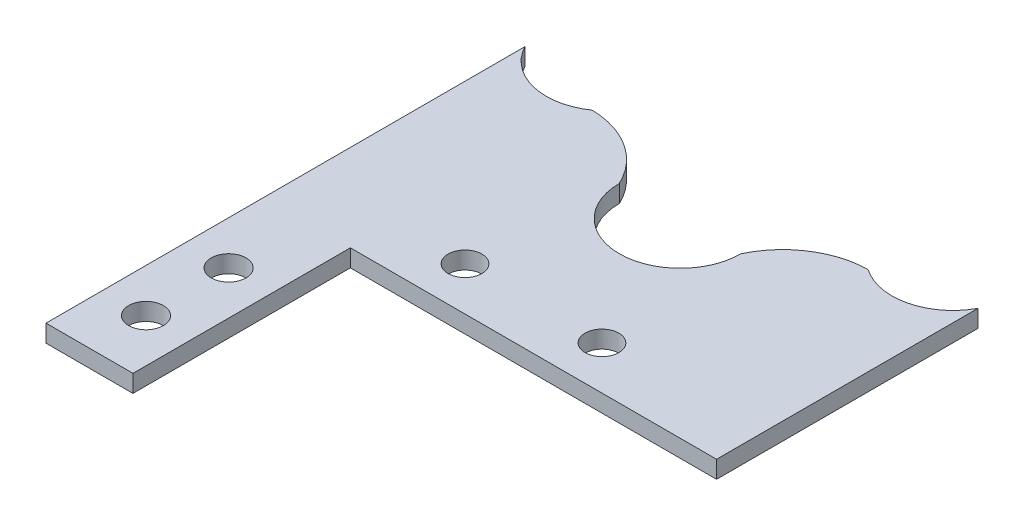
ISO-10303-21;
HEADER;
FILE_DESCRIPTION(('STEP AP214'),'2;1');
FILE_NAME('part.step','',(''),(''),'','','');
FILE_SCHEMA(('AUTOMOTIVE_DESIGN { 1 0 10303 214 1 1 1 1 }'));
ENDSEC;
DATA;
#1=APPLICATION_CONTEXT('core data for automotive mechanical design processes');
#2=APPLICATION_PROTOCOL_DEFINITION('international standard','automotive_design',2000,#1);
#3=PRODUCT_CONTEXT('',#1,'mechanical');
#4=PRODUCT('Part','Part','',(#3));
#5=PRODUCT_RELATED_PRODUCT_CATEGORY('part','',(#4));
#6=PRODUCT_DEFINITION_FORMATION('','',#4);
#7=PRODUCT_DEFINITION_CONTEXT('part definition',#1,'design');
#8=PRODUCT_DEFINITION('design','',#6,#7);
#9=PRODUCT_DEFINITION_SHAPE('','',#8);
#10=(LENGTH_UNIT() NAMED_UNIT(*) SI_UNIT(.MILLI.,.METRE.));
#11=(NAMED_UNIT(*) PLANE_ANGLE_UNIT() SI_UNIT($,.RADIAN.));
#12=(NAMED_UNIT(*) SI_UNIT($,.STERADIAN.) SOLID_ANGLE_UNIT());
#13=UNCERTAINTY_MEASURE_WITH_UNIT(LENGTH_MEASURE(1.E-05),#10,'distance_accuracy_value','');
#14=(GEOMETRIC_REPRESENTATION_CONTEXT(3) GLOBAL_UNCERTAINTY_ASSIGNED_CONTEXT((#13)) GLOBAL_UNIT_ASSIGNED_CONTEXT((#10,
#11,#12)) REPRESENTATION_CONTEXT('',''));
#15=CARTESIAN_POINT('',(0.,0.,0.));
#16=DIRECTION('',(0.,0.,1.));
#17=DIRECTION('',(1.,0.,0.));
#18=AXIS2_PLACEMENT_3D('',#15,#16,#17);
#19=CARTESIAN_POINT('',(16.0451571243017,-2.,4.26440295899608));
#20=DIRECTION('',(0.,1.,0.));
#21=DIRECTION('',(0.,0.,1.));
#22=AXIS2_PLACEMENT_3D('',#19,#20,#21);
#23=CYLINDRICAL_SURFACE('',#22,10.);
#24=CARTESIAN_POINT('',(16.0451571243017,0.,4.26440295899608));
#25=DIRECTION('',(0.,1.,0.));
#26=DIRECTION('',(0.,0.,1.));
#27=AXIS2_PLACEMENT_3D('',#24,#25,#26);
#28=CIRCLE('',#27,10.);
#29=CARTESIAN_POINT('',(15.8700792263388,0.,-5.73406431002295));
#30=VERTEX_POINT('',#29);
#31=CARTESIAN_POINT('',(7.,0.,0.));
#32=VERTEX_POINT('',#31);
#33=EDGE_CURVE('E152',#30,#32,#28,.T.);
#34=ORIENTED_EDGE('',*,*,#33,.F.);
#35=DIRECTION('',(0.,1.,0.));
#36=VECTOR('',#35,1.);
#37=CARTESIAN_POINT('',(15.8700792263388,-2.,-5.73406431002295));
#38=LINE('',#37,#36);
#39=CARTESIAN_POINT('',(15.8700792263388,-2.,-5.73406431002295));
#40=VERTEX_POINT('',#39);
#41=EDGE_CURVE('E11',#40,#30,#38,.T.);
#42=ORIENTED_EDGE('',*,*,#41,.F.);
#43=CARTESIAN_POINT('',(16.0451571243017,-2.,4.26440295899608));
#44=DIRECTION('',(0.,1.,0.));
#45=DIRECTION('',(0.,0.,1.));
#46=AXIS2_PLACEMENT_3D('',#43,#44,#45);
#47=CIRCLE('',#46,10.);
#48=CARTESIAN_POINT('',(7.,-2.,0.));
#49=VERTEX_POINT('',#48);
#50=EDGE_CURVE('E179',#40,#49,#47,.T.);
#51=ORIENTED_EDGE('',*,*,#50,.T.);
#52=DIRECTION('',(0.,1.,0.));
#53=VECTOR('',#52,1.);
#54=CARTESIAN_POINT('',(7.,-2.,0.));
#55=LINE('',#54,#53);
#56=EDGE_CURVE('E46',#49,#32,#55,.T.);
#57=ORIENTED_EDGE('',*,*,#56,.T.);
#58=EDGE_LOOP('',(#34,#42,#51,#57));
#59=FACE_BOUND('',#58,.T.);
#60=ADVANCED_FACE('F43',(#59),#23,.T.);
#61=CARTESIAN_POINT('',(19.8752830168529,-2.,-11.4749999999999));
#62=DIRECTION('',(0.,1.,0.));
#63=DIRECTION('',(0.,0.,1.));
#64=AXIS2_PLACEMENT_3D('',#61,#62,#63);
#65=CYLINDRICAL_SURFACE('',#64,7.);
#66=CARTESIAN_POINT('',(19.8752830168529,0.,-11.4749999999999));
#67=DIRECTION('',(0.,-1.,0.));
#68=DIRECTION('',(0.,0.,1.));
#69=AXIS2_PLACEMENT_3D('',#66,#67,#68);
#70=CIRCLE('',#69,7.);
#71=CARTESIAN_POINT('',(26.0555691185354,0.,-8.18804644064582));
#72=VERTEX_POINT('',#71);
#73=EDGE_CURVE('E177',#72,#30,#70,.T.);
#74=ORIENTED_EDGE('',*,*,#73,.F.);
#75=DIRECTION('',(0.,1.,0.));
#76=VECTOR('',#75,1.);
#77=CARTESIAN_POINT('',(26.0555691185354,-2.,-8.18804644064582));
#78=LINE('',#77,#76);
#79=CARTESIAN_POINT('',(26.0555691185354,-2.,-8.18804644064582));
#80=VERTEX_POINT('',#79);
#81=EDGE_CURVE('E52',#80,#72,#78,.T.);
#82=ORIENTED_EDGE('',*,*,#81,.F.);
#83=CARTESIAN_POINT('',(19.8752830168529,-2.,-11.4749999999999));
#84=DIRECTION('',(0.,-1.,0.));
#85=DIRECTION('',(0.,0.,1.));
#86=AXIS2_PLACEMENT_3D('',#83,#84,#85);
#87=CIRCLE('',#86,7.);
#88=EDGE_CURVE('E142',#80,#40,#87,.T.);
#89=ORIENTED_EDGE('',*,*,#88,.T.);
#90=ORIENTED_EDGE('',*,*,#41,.T.);
#91=EDGE_LOOP('',(#74,#82,#89,#90));
#92=FACE_BOUND('',#91,.T.);
#93=ADVANCED_FACE('F196',(#92),#65,.F.);
#94=CARTESIAN_POINT('',(26.0555691185354,-2.,-8.18804644064582));
#95=DIRECTION('',(1.,0.,0.));
#96=DIRECTION('',(0.,0.,-1.));
#97=AXIS2_PLACEMENT_3D('',#94,#95,#96);
#98=PLANE('',#97);
#99=DIRECTION('',(0.,0.,-1.));
#100=VECTOR('',#99,1.);
#101=CARTESIAN_POINT('',(26.0555691185354,0.,-8.18804644064582));
#102=LINE('',#101,#100);
#103=CARTESIAN_POINT('',(26.0555691185354,0.,21.875));
#104=VERTEX_POINT('',#103);
#105=EDGE_CURVE('E129',#104,#72,#102,.T.);
#106=ORIENTED_EDGE('',*,*,#105,.F.);
#107=DIRECTION('',(0.,1.,0.));
#108=VECTOR('',#107,1.);
#109=CARTESIAN_POINT('',(26.0555691185354,-2.,21.875));
#110=LINE('',#109,#108);
#111=CARTESIAN_POINT('',(26.0555691185354,-2.,21.875));
#112=VERTEX_POINT('',#111);
#113=EDGE_CURVE('E124',#112,#104,#110,.T.);
#114=ORIENTED_EDGE('',*,*,#113,.F.);
#115=DIRECTION('',(0.,0.,-1.));
#116=VECTOR('',#115,1.);
#117=CARTESIAN_POINT('',(26.0555691185354,-2.,-8.18804644064582));
#118=LINE('',#117,#116);
#119=EDGE_CURVE('E127',#112,#80,#118,.T.);
#120=ORIENTED_EDGE('',*,*,#119,.T.);
#121=ORIENTED_EDGE('',*,*,#81,.T.);
#122=EDGE_LOOP('',(#106,#114,#120,#121));
#123=FACE_BOUND('',#122,.T.);
#124=ADVANCED_FACE('F126',(#123),#98,.T.);
#125=CARTESIAN_POINT('',(-16.0555691185354,-2.,21.875));
#126=DIRECTION('',(0.,0.,1.));
#127=DIRECTION('',(1.,0.,0.));
#128=AXIS2_PLACEMENT_3D('',#125,#126,#127);
#129=PLANE('',#128);
#130=DIRECTION('',(1.,0.,0.));
#131=VECTOR('',#130,1.);
#132=CARTESIAN_POINT('',(-16.0555691185354,0.,21.875));
#133=LINE('',#132,#131);
#134=CARTESIAN_POINT('',(-16.0555691185354,0.,21.875));
#135=VERTEX_POINT('',#134);
#136=EDGE_CURVE('E174',#135,#104,#133,.T.);
#137=ORIENTED_EDGE('',*,*,#136,.F.);
#138=DIRECTION('',(0.,1.,0.));
#139=VECTOR('',#138,1.);
#140=CARTESIAN_POINT('',(-16.0555691185354,-2.,21.875));
#141=LINE('',#140,#139);
#142=CARTESIAN_POINT('',(-16.0555691185354,-2.,21.875));
#143=VERTEX_POINT('',#142);
#144=EDGE_CURVE('E134',#143,#135,#141,.T.);
#145=ORIENTED_EDGE('',*,*,#144,.F.);
#146=DIRECTION('',(1.,0.,0.));
#147=VECTOR('',#146,1.);
#148=CARTESIAN_POINT('',(-16.0555691185354,-2.,21.875));
#149=LINE('',#148,#147);
#150=EDGE_CURVE('E140',#143,#112,#149,.T.);
#151=ORIENTED_EDGE('',*,*,#150,.T.);
#152=ORIENTED_EDGE('',*,*,#113,.T.);
#153=EDGE_LOOP('',(#137,#145,#151,#152));
#154=FACE_BOUND('',#153,.T.);
#155=ADVANCED_FACE('F144',(#154),#129,.T.);
#156=CARTESIAN_POINT('',(-16.0555691185354,-2.,46.875));
#157=DIRECTION('',(1.,0.,0.));
#158=DIRECTION('',(0.,0.,-1.));
#159=AXIS2_PLACEMENT_3D('',#156,#157,#158);
#160=PLANE('',#159);
#161=DIRECTION('',(0.,0.,-1.));
#162=VECTOR('',#161,1.);
#163=CARTESIAN_POINT('',(-16.0555691185354,0.,46.875));
#164=LINE('',#163,#162);
#165=CARTESIAN_POINT('',(-16.0555691185354,0.,46.875));
#166=VERTEX_POINT('',#165);
#167=EDGE_CURVE('E171',#166,#135,#164,.T.);
#168=ORIENTED_EDGE('',*,*,#167,.F.);
#169=DIRECTION('',(0.,1.,0.));
#170=VECTOR('',#169,1.);
#171=CARTESIAN_POINT('',(-16.0555691185354,-2.,46.875));
#172=LINE('',#171,#170);
#173=CARTESIAN_POINT('',(-16.0555691185354,-2.,46.875));
#174=VERTEX_POINT('',#173);
#175=EDGE_CURVE('E183',#174,#166,#172,.T.);
#176=ORIENTED_EDGE('',*,*,#175,.F.);
#177=DIRECTION('',(0.,0.,-1.));
#178=VECTOR('',#177,1.);
#179=CARTESIAN_POINT('',(-16.0555691185354,-2.,46.875));
#180=LINE('',#179,#178);
#181=EDGE_CURVE('E145',#174,#143,#180,.T.);
#182=ORIENTED_EDGE('',*,*,#181,.T.);
#183=ORIENTED_EDGE('',*,*,#144,.T.);
#184=EDGE_LOOP('',(#168,#176,#182,#183));
#185=FACE_BOUND('',#184,.T.);
#186=ADVANCED_FACE('F209',(#185),#160,.T.);
#187=CARTESIAN_POINT('',(-26.0555691185354,-2.,46.875));
#188=DIRECTION('',(0.,0.,1.));
#189=DIRECTION('',(1.,0.,0.));
#190=AXIS2_PLACEMENT_3D('',#187,#188,#189);
#191=PLANE('',#190);
#192=DIRECTION('',(1.,0.,0.));
#193=VECTOR('',#192,1.);
#194=CARTESIAN_POINT('',(-26.0555691185354,0.,46.875));
#195=LINE('',#194,#193);
#196=CARTESIAN_POINT('',(-26.0555691185354,0.,46.875));
#197=VERTEX_POINT('',#196);
#198=EDGE_CURVE('E168',#197,#166,#195,.T.);
#199=ORIENTED_EDGE('',*,*,#198,.F.);
#200=DIRECTION('',(0.,1.,0.));
#201=VECTOR('',#200,1.);
#202=CARTESIAN_POINT('',(-26.0555691185354,-2.,46.875));
#203=LINE('',#202,#201);
#204=CARTESIAN_POINT('',(-26.0555691185354,-2.,46.875));
#205=VERTEX_POINT('',#204);
#206=EDGE_CURVE('E185',#205,#197,#203,.T.);
#207=ORIENTED_EDGE('',*,*,#206,.F.);
#208=DIRECTION('',(1.,0.,0.));
#209=VECTOR('',#208,1.);
#210=CARTESIAN_POINT('',(-26.0555691185354,-2.,46.875));
#211=LINE('',#210,#209);
#212=EDGE_CURVE('E147',#205,#174,#211,.T.);
#213=ORIENTED_EDGE('',*,*,#212,.T.);
#214=ORIENTED_EDGE('',*,*,#175,.T.);
#215=EDGE_LOOP('',(#199,#207,#213,#214));
#216=FACE_BOUND('',#215,.T.);
#217=ADVANCED_FACE('F212',(#216),#191,.T.);
#218=CARTESIAN_POINT('',(-26.0555691185354,-2.,21.875));
#219=DIRECTION('',(-1.,0.,0.));
#220=DIRECTION('',(0.,0.,1.));
#221=AXIS2_PLACEMENT_3D('',#218,#219,#220);
#222=PLANE('',#221);
#223=DIRECTION('',(0.,0.,1.));
#224=VECTOR('',#223,1.);
#225=CARTESIAN_POINT('',(-26.0555691185354,0.,21.875));
#226=LINE('',#225,#224);
#227=CARTESIAN_POINT('',(-26.0555691185354,0.,-8.18804644064587));
#228=VERTEX_POINT('',#227);
#229=EDGE_CURVE('E165',#228,#197,#226,.T.);
#230=ORIENTED_EDGE('',*,*,#229,.F.);
#231=DIRECTION('',(0.,1.,0.));
#232=VECTOR('',#231,1.);
#233=CARTESIAN_POINT('',(-26.0555691185354,-2.,-8.18804644064587));
#234=LINE('',#233,#232);
#235=CARTESIAN_POINT('',(-26.0555691185354,-2.,-8.18804644064587));
#236=VERTEX_POINT('',#235);
#237=EDGE_CURVE('E187',#236,#228,#234,.T.);
#238=ORIENTED_EDGE('',*,*,#237,.F.);
#239=DIRECTION('',(0.,0.,1.));
#240=VECTOR('',#239,1.);
#241=CARTESIAN_POINT('',(-26.0555691185354,-2.,21.875));
#242=LINE('',#241,#240);
#243=EDGE_CURVE('E292',#236,#205,#242,.T.);
#244=ORIENTED_EDGE('',*,*,#243,.T.);
#245=ORIENTED_EDGE('',*,*,#206,.T.);
#246=EDGE_LOOP('',(#230,#238,#244,#245));
#247=FACE_BOUND('',#246,.T.);
#248=ADVANCED_FACE('F216',(#247),#222,.T.);
#249=CARTESIAN_POINT('',(-19.8752830168529,-2.,-11.4749999999999));
#250=DIRECTION('',(0.,1.,0.));
#251=DIRECTION('',(0.,0.,1.));
#252=AXIS2_PLACEMENT_3D('',#249,#250,#251);
#253=CYLINDRICAL_SURFACE('',#252,7.);
#254=CARTESIAN_POINT('',(-19.8752830168529,0.,-11.4749999999999));
#255=DIRECTION('',(0.,-1.,0.));
#256=DIRECTION('',(0.,0.,-1.));
#257=AXIS2_PLACEMENT_3D('',#254,#255,#256);
#258=CIRCLE('',#257,7.);
#259=CARTESIAN_POINT('',(-15.8700792263388,0.,-5.73406431002294));
#260=VERTEX_POINT('',#259);
#261=EDGE_CURVE('E162',#260,#228,#258,.T.);
#262=ORIENTED_EDGE('',*,*,#261,.F.);
#263=DIRECTION('',(0.,1.,0.));
#264=VECTOR('',#263,1.);
#265=CARTESIAN_POINT('',(-15.8700792263388,-2.,-5.73406431002294));
#266=LINE('',#265,#264);
#267=CARTESIAN_POINT('',(-15.8700792263388,-2.,-5.73406431002294));
#268=VERTEX_POINT('',#267);
#269=EDGE_CURVE('E190',#268,#260,#266,.T.);
#270=ORIENTED_EDGE('',*,*,#269,.F.);
#271=CARTESIAN_POINT('',(-19.8752830168529,-2.,-11.4749999999999));
#272=DIRECTION('',(0.,-1.,0.));
#273=DIRECTION('',(0.,0.,-1.));
#274=AXIS2_PLACEMENT_3D('',#271,#272,#273);
#275=CIRCLE('',#274,7.);
#276=EDGE_CURVE('E289',#268,#236,#275,.T.);
#277=ORIENTED_EDGE('',*,*,#276,.T.);
#278=ORIENTED_EDGE('',*,*,#237,.T.);
#279=EDGE_LOOP('',(#262,#270,#277,#278));
#280=FACE_BOUND('',#279,.T.);
#281=ADVANCED_FACE('F220',(#280),#253,.F.);
#282=CARTESIAN_POINT('',(-16.0451571243017,-2.,4.26440295899608));
#283=DIRECTION('',(0.,1.,0.));
#284=DIRECTION('',(0.,0.,1.));
#285=AXIS2_PLACEMENT_3D('',#282,#283,#284);
#286=CYLINDRICAL_SURFACE('',#285,9.99999999999999);
#287=CARTESIAN_POINT('',(-16.0451571243017,0.,4.26440295899608));
#288=DIRECTION('',(0.,1.,0.));
#289=DIRECTION('',(0.,0.,1.));
#290=AXIS2_PLACEMENT_3D('',#287,#288,#289);
#291=CIRCLE('',#290,9.99999999999999);
#292=CARTESIAN_POINT('',(-7.,0.,0.));
#293=VERTEX_POINT('',#292);
#294=EDGE_CURVE('E159',#293,#260,#291,.T.);
#295=ORIENTED_EDGE('',*,*,#294,.F.);
#296=DIRECTION('',(0.,1.,0.));
#297=VECTOR('',#296,1.);
#298=CARTESIAN_POINT('',(-7.,-2.,0.));
#299=LINE('',#298,#297);
#300=CARTESIAN_POINT('',(-7.,-2.,0.));
#301=VERTEX_POINT('',#300);
#302=EDGE_CURVE('E191',#301,#293,#299,.T.);
#303=ORIENTED_EDGE('',*,*,#302,.F.);
#304=CARTESIAN_POINT('',(-16.0451571243017,-2.,4.26440295899608));
#305=DIRECTION('',(0.,1.,0.));
#306=DIRECTION('',(0.,0.,1.));
#307=AXIS2_PLACEMENT_3D('',#304,#305,#306);
#308=CIRCLE('',#307,9.99999999999999);
#309=EDGE_CURVE('E286',#301,#268,#308,.T.);
#310=ORIENTED_EDGE('',*,*,#309,.T.);
#311=ORIENTED_EDGE('',*,*,#269,.T.);
#312=EDGE_LOOP('',(#295,#303,#310,#311));
#313=FACE_BOUND('',#312,.T.);
#314=ADVANCED_FACE('F224',(#313),#286,.T.);
#315=CARTESIAN_POINT('',(0.,-2.,0.));
#316=DIRECTION('',(0.,1.,0.));
#317=DIRECTION('',(0.,0.,1.));
#318=AXIS2_PLACEMENT_3D('',#315,#316,#317);
#319=CYLINDRICAL_SURFACE('',#318,7.);
#320=CARTESIAN_POINT('',(0.,0.,0.));
#321=DIRECTION('',(0.,-1.,0.));
#322=DIRECTION('',(0.,0.,-1.));
#323=AXIS2_PLACEMENT_3D('',#320,#321,#322);
#324=CIRCLE('',#323,7.);
#325=EDGE_CURVE('E155',#32,#293,#324,.T.);
#326=ORIENTED_EDGE('',*,*,#325,.F.);
#327=ORIENTED_EDGE('',*,*,#56,.F.);
#328=CARTESIAN_POINT('',(0.,-2.,0.));
#329=DIRECTION('',(0.,-1.,0.));
#330=DIRECTION('',(0.,0.,-1.));
#331=AXIS2_PLACEMENT_3D('',#328,#329,#330);
#332=CIRCLE('',#331,7.);
#333=EDGE_CURVE('E284',#49,#301,#332,.T.);
#334=ORIENTED_EDGE('',*,*,#333,.T.);
#335=ORIENTED_EDGE('',*,*,#302,.T.);
#336=EDGE_LOOP('',(#326,#327,#334,#335));
#337=FACE_BOUND('',#336,.T.);
#338=ADVANCED_FACE('F193',(#337),#319,.F.);
#339=CARTESIAN_POINT('',(16.0451571243017,-2.,4.26440295899608));
#340=DIRECTION('',(0.,1.,0.));
#341=DIRECTION('',(0.,0.,1.));
#342=AXIS2_PLACEMENT_3D('',#339,#340,#341);
#343=PLANE('',#342);
#344=CARTESIAN_POINT('',(-7.87528301685294,-2.,16.875));
#345=DIRECTION('',(0.,1.,0.));
#346=DIRECTION('',(0.,0.,1.));
#347=AXIS2_PLACEMENT_3D('',#344,#345,#346);
#348=CIRCLE('',#347,1.9431);
#349=CARTESIAN_POINT('',(-7.87528301685294,-2.,18.8181));
#350=VERTEX_POINT('',#349);
#351=EDGE_CURVE('E259',#350,#350,#348,.F.);
#352=ORIENTED_EDGE('',*,*,#351,.F.);
#353=EDGE_LOOP('',(#352));
#354=FACE_BOUND('',#353,.T.);
#355=CARTESIAN_POINT('',(7.87528301685294,-2.,16.875));
#356=DIRECTION('',(0.,1.,0.));
#357=DIRECTION('',(0.,0.,1.));
#358=AXIS2_PLACEMENT_3D('',#355,#356,#357);
#359=CIRCLE('',#358,1.9431);
#360=CARTESIAN_POINT('',(7.87528301685294,-2.,18.8181));
#361=VERTEX_POINT('',#360);
#362=EDGE_CURVE('E268',#361,#361,#359,.F.);
#363=ORIENTED_EDGE('',*,*,#362,.F.);
#364=EDGE_LOOP('',(#363));
#365=FACE_BOUND('',#364,.T.);
#366=CARTESIAN_POINT('',(-21.0555691185354,-2.,40.375));
#367=DIRECTION('',(0.,1.,0.));
#368=DIRECTION('',(0.,0.,1.));
#369=AXIS2_PLACEMENT_3D('',#366,#367,#368);
#370=CIRCLE('',#369,2.00000000000001);
#371=CARTESIAN_POINT('',(-21.0555691185354,-2.,42.375));
#372=VERTEX_POINT('',#371);
#373=EDGE_CURVE('E156',#372,#372,#370,.F.);
#374=ORIENTED_EDGE('',*,*,#373,.F.);
#375=EDGE_LOOP('',(#374));
#376=FACE_BOUND('',#375,.T.);
#377=CARTESIAN_POINT('',(-21.0555691185354,-2.,30.875));
#378=DIRECTION('',(0.,1.,0.));
#379=DIRECTION('',(0.,0.,1.));
#380=AXIS2_PLACEMENT_3D('',#377,#378,#379);
#381=CIRCLE('',#380,2.00000000000001);
#382=CARTESIAN_POINT('',(-21.0555691185354,-2.,32.875));
#383=VERTEX_POINT('',#382);
#384=EDGE_CURVE('E276',#383,#383,#381,.F.);
#385=ORIENTED_EDGE('',*,*,#384,.F.);
#386=EDGE_LOOP('',(#385));
#387=FACE_BOUND('',#386,.T.);
#388=ORIENTED_EDGE('',*,*,#50,.F.);
#389=ORIENTED_EDGE('',*,*,#88,.F.);
#390=ORIENTED_EDGE('',*,*,#119,.F.);
#391=ORIENTED_EDGE('',*,*,#150,.F.);
#392=ORIENTED_EDGE('',*,*,#181,.F.);
#393=ORIENTED_EDGE('',*,*,#212,.F.);
#394=ORIENTED_EDGE('',*,*,#243,.F.);
#395=ORIENTED_EDGE('',*,*,#276,.F.);
#396=ORIENTED_EDGE('',*,*,#309,.F.);
#397=ORIENTED_EDGE('',*,*,#333,.F.);
#398=EDGE_LOOP('',(#388,#389,#390,#391,#392,#393,#394,#395,#396,#397));
#399=FACE_BOUND('',#398,.T.);
#400=ADVANCED_FACE('F138',(#354,#365,#376,#387,#399),#343,.F.);
#401=CARTESIAN_POINT('',(16.0451571243017,0.,4.26440295899608));
#402=DIRECTION('',(0.,1.,0.));
#403=DIRECTION('',(0.,0.,1.));
#404=AXIS2_PLACEMENT_3D('',#401,#402,#403);
#405=PLANE('',#404);
#406=CARTESIAN_POINT('',(-7.87528301685294,0.,16.875));
#407=DIRECTION('',(0.,1.,0.));
#408=DIRECTION('',(0.,0.,1.));
#409=AXIS2_PLACEMENT_3D('',#406,#407,#408);
#410=CIRCLE('',#409,1.9431);
#411=CARTESIAN_POINT('',(-7.87528301685294,0.,18.8181));
#412=VERTEX_POINT('',#411);
#413=EDGE_CURVE('E262',#412,#412,#410,.T.);
#414=ORIENTED_EDGE('',*,*,#413,.F.);
#415=EDGE_LOOP('',(#414));
#416=FACE_BOUND('',#415,.T.);
#417=CARTESIAN_POINT('',(7.87528301685294,0.,16.875));
#418=DIRECTION('',(0.,1.,0.));
#419=DIRECTION('',(0.,0.,1.));
#420=AXIS2_PLACEMENT_3D('',#417,#418,#419);
#421=CIRCLE('',#420,1.9431);
#422=CARTESIAN_POINT('',(7.87528301685294,0.,18.8181));
#423=VERTEX_POINT('',#422);
#424=EDGE_CURVE('E263',#423,#423,#421,.T.);
#425=ORIENTED_EDGE('',*,*,#424,.F.);
#426=EDGE_LOOP('',(#425));
#427=FACE_BOUND('',#426,.T.);
#428=CARTESIAN_POINT('',(-21.0555691185354,0.,40.375));
#429=DIRECTION('',(0.,1.,0.));
#430=DIRECTION('',(0.,0.,1.));
#431=AXIS2_PLACEMENT_3D('',#428,#429,#430);
#432=CIRCLE('',#431,2.00000000000001);
#433=CARTESIAN_POINT('',(-21.0555691185354,0.,42.375));
#434=VERTEX_POINT('',#433);
#435=EDGE_CURVE('E273',#434,#434,#432,.T.);
#436=ORIENTED_EDGE('',*,*,#435,.F.);
#437=EDGE_LOOP('',(#436));
#438=FACE_BOUND('',#437,.T.);
#439=CARTESIAN_POINT('',(-21.0555691185354,0.,30.875));
#440=DIRECTION('',(0.,1.,0.));
#441=DIRECTION('',(0.,0.,1.));
#442=AXIS2_PLACEMENT_3D('',#439,#440,#441);
#443=CIRCLE('',#442,2.00000000000001);
#444=CARTESIAN_POINT('',(-21.0555691185354,0.,32.875));
#445=VERTEX_POINT('',#444);
#446=EDGE_CURVE('E265',#445,#445,#443,.T.);
#447=ORIENTED_EDGE('',*,*,#446,.F.);
#448=EDGE_LOOP('',(#447));
#449=FACE_BOUND('',#448,.T.);
#450=ORIENTED_EDGE('',*,*,#33,.T.);
#451=ORIENTED_EDGE('',*,*,#325,.T.);
#452=ORIENTED_EDGE('',*,*,#294,.T.);
#453=ORIENTED_EDGE('',*,*,#261,.T.);
#454=ORIENTED_EDGE('',*,*,#229,.T.);
#455=ORIENTED_EDGE('',*,*,#198,.T.);
#456=ORIENTED_EDGE('',*,*,#167,.T.);
#457=ORIENTED_EDGE('',*,*,#136,.T.);
#458=ORIENTED_EDGE('',*,*,#105,.T.);
#459=ORIENTED_EDGE('',*,*,#73,.T.);
#460=EDGE_LOOP('',(#450,#451,#452,#453,#454,#455,#456,#457,#458,#459));
#461=FACE_BOUND('',#460,.T.);
#462=ADVANCED_FACE('F195',(#416,#427,#438,#449,#461),#405,.T.);
#463=CARTESIAN_POINT('',(-21.0555691185354,-7.6568542494924,30.875));
#464=DIRECTION('',(0.,1.,0.));
#465=DIRECTION('',(0.,0.,1.));
#466=AXIS2_PLACEMENT_3D('',#463,#464,#465);
#467=CYLINDRICAL_SURFACE('',#466,2.00000000000001);
#468=ORIENTED_EDGE('',*,*,#384,.T.);
#469=EDGE_LOOP('',(#468));
#470=FACE_BOUND('',#469,.T.);
#471=ORIENTED_EDGE('',*,*,#446,.T.);
#472=EDGE_LOOP('',(#471));
#473=FACE_BOUND('',#472,.T.);
#474=ADVANCED_FACE('F238',(#470,#473),#467,.F.);
#475=CARTESIAN_POINT('',(-21.0555691185354,-7.6568542494924,40.375));
#476=DIRECTION('',(0.,1.,0.));
#477=DIRECTION('',(0.,0.,1.));
#478=AXIS2_PLACEMENT_3D('',#475,#476,#477);
#479=CYLINDRICAL_SURFACE('',#478,2.00000000000001);
#480=ORIENTED_EDGE('',*,*,#373,.T.);
#481=EDGE_LOOP('',(#480));
#482=FACE_BOUND('',#481,.T.);
#483=ORIENTED_EDGE('',*,*,#435,.T.);
#484=EDGE_LOOP('',(#483));
#485=FACE_BOUND('',#484,.T.);
#486=ADVANCED_FACE('F244',(#482,#485),#479,.F.);
#487=CARTESIAN_POINT('',(7.87528301685294,-7.49591674609432,16.875));
#488=DIRECTION('',(0.,1.,0.));
#489=DIRECTION('',(0.,0.,1.));
#490=AXIS2_PLACEMENT_3D('',#487,#488,#489);
#491=CYLINDRICAL_SURFACE('',#490,1.9431);
#492=CARTESIAN_POINT('',(7.87528301685294,-2.,18.8181));
#493=CARTESIAN_POINT('',(7.87528301685294,-1.97916666666667,18.8181));
#494=CARTESIAN_POINT('',(7.87528301685294,-1.95833333333333,18.8181));
#495=CARTESIAN_POINT('',(7.87528301685294,-1.91666666666667,18.8181));
#496=CARTESIAN_POINT('',(7.87528301685294,-1.89583333333333,18.8181));
#497=CARTESIAN_POINT('',(7.87528301685294,-1.85416666666667,18.8181));
#498=CARTESIAN_POINT('',(7.87528301685294,-1.83333333333333,18.8181));
#499=CARTESIAN_POINT('',(7.87528301685294,-1.79166666666667,18.8181));
#500=CARTESIAN_POINT('',(7.87528301685294,-1.77083333333333,18.8181));
#501=CARTESIAN_POINT('',(7.87528301685294,-1.72916666666667,18.8181));
#502=CARTESIAN_POINT('',(7.87528301685294,-1.70833333333333,18.8181));
#503=CARTESIAN_POINT('',(7.87528301685294,-1.66666666666667,18.8181));
#504=CARTESIAN_POINT('',(7.87528301685294,-1.64583333333333,18.8181));
#505=CARTESIAN_POINT('',(7.87528301685294,-1.60416666666667,18.8181));
#506=CARTESIAN_POINT('',(7.87528301685294,-1.58333333333333,18.8181));
#507=CARTESIAN_POINT('',(7.87528301685294,-1.54166666666667,18.8181));
#508=CARTESIAN_POINT('',(7.87528301685294,-1.52083333333333,18.8181));
#509=CARTESIAN_POINT('',(7.87528301685294,-1.47916666666667,18.8181));
#510=CARTESIAN_POINT('',(7.87528301685294,-1.45833333333333,18.8181));
#511=CARTESIAN_POINT('',(7.87528301685294,-1.41666666666667,18.8181));
#512=CARTESIAN_POINT('',(7.87528301685294,-1.39583333333333,18.8181));
#513=CARTESIAN_POINT('',(7.87528301685294,-1.35416666666667,18.8181));
#514=CARTESIAN_POINT('',(7.87528301685294,-1.33333333333333,18.8181));
#515=CARTESIAN_POINT('',(7.87528301685294,-1.29166666666667,18.8181));
#516=CARTESIAN_POINT('',(7.87528301685294,-1.27083333333333,18.8181));
#517=CARTESIAN_POINT('',(7.87528301685294,-1.22916666666667,18.8181));
#518=CARTESIAN_POINT('',(7.87528301685294,-1.20833333333333,18.8181));
#519=CARTESIAN_POINT('',(7.87528301685294,-1.16666666666667,18.8181));
#520=CARTESIAN_POINT('',(7.87528301685294,-1.14583333333333,18.8181));
#521=CARTESIAN_POINT('',(7.87528301685294,-1.10416666666667,18.8181));
#522=CARTESIAN_POINT('',(7.87528301685294,-1.08333333333333,18.8181));
#523=CARTESIAN_POINT('',(7.87528301685294,-1.04166666666667,18.8181));
#524=CARTESIAN_POINT('',(7.87528301685294,-1.02083333333333,18.8181));
#525=CARTESIAN_POINT('',(7.87528301685294,-0.979166666666668,18.8181));
#526=CARTESIAN_POINT('',(7.87528301685294,-0.958333333333334,18.8181));
#527=CARTESIAN_POINT('',(7.87528301685294,-0.916666666666668,18.8181));
#528=CARTESIAN_POINT('',(7.87528301685294,-0.895833333333334,18.8181));
#529=CARTESIAN_POINT('',(7.87528301685294,-0.854166666666667,18.8181));
#530=CARTESIAN_POINT('',(7.87528301685294,-0.833333333333334,18.8181));
#531=CARTESIAN_POINT('',(7.87528301685294,-0.791666666666667,18.8181));
#532=CARTESIAN_POINT('',(7.87528301685294,-0.770833333333334,18.8181));
#533=CARTESIAN_POINT('',(7.87528301685294,-0.729166666666667,18.8181));
#534=CARTESIAN_POINT('',(7.87528301685294,-0.708333333333334,18.8181));
#535=CARTESIAN_POINT('',(7.87528301685294,-0.666666666666668,18.8181));
#536=CARTESIAN_POINT('',(7.87528301685294,-0.645833333333334,18.8181));
#537=CARTESIAN_POINT('',(7.87528301685294,-0.604166666666668,18.8181));
#538=CARTESIAN_POINT('',(7.87528301685294,-0.583333333333335,18.8181));
#539=CARTESIAN_POINT('',(7.87528301685294,-0.541666666666668,18.8181));
#540=CARTESIAN_POINT('',(7.87528301685294,-0.520833333333335,18.8181));
#541=CARTESIAN_POINT('',(7.87528301685294,-0.479166666666668,18.8181));
#542=CARTESIAN_POINT('',(7.87528301685294,-0.458333333333335,18.8181));
#543=CARTESIAN_POINT('',(7.87528301685294,-0.416666666666668,18.8181));
#544=CARTESIAN_POINT('',(7.87528301685294,-0.395833333333335,18.8181));
#545=CARTESIAN_POINT('',(7.87528301685294,-0.354166666666668,18.8181));
#546=CARTESIAN_POINT('',(7.87528301685294,-0.333333333333335,18.8181));
#547=CARTESIAN_POINT('',(7.87528301685294,-0.291666666666668,18.8181));
#548=CARTESIAN_POINT('',(7.87528301685294,-0.270833333333334,18.8181));
#549=CARTESIAN_POINT('',(7.87528301685294,-0.229166666666668,18.8181));
#550=CARTESIAN_POINT('',(7.87528301685294,-0.208333333333334,18.8181));
#551=CARTESIAN_POINT('',(7.87528301685294,-0.166666666666668,18.8181));
#552=CARTESIAN_POINT('',(7.87528301685294,-0.145833333333334,18.8181));
#553=CARTESIAN_POINT('',(7.87528301685294,-0.104166666666668,18.8181));
#554=CARTESIAN_POINT('',(7.87528301685294,-0.0833333333333343,18.8181));
#555=CARTESIAN_POINT('',(7.87528301685294,-0.0416666666666676,18.8181));
#556=CARTESIAN_POINT('',(7.87528301685294,-0.0208333333333342,18.8181));
#557=CARTESIAN_POINT('',(7.87528301685294,0.,18.8181));
#558=B_SPLINE_CURVE_WITH_KNOTS('',3,(#492,#493,#494,#495,#496,#497,#498,#499,#500,#501,#502,
#503,#504,#505,#506,#507,#508,#509,#510,#511,#512,#513,#514,#515,#516,#517,#518,#519,#520,#521,
#522,#523,#524,#525,#526,#527,#528,#529,#530,#531,#532,#533,#534,#535,#536,#537,#538,#539,#540,
#541,#542,#543,#544,#545,#546,#547,#548,#549,#550,#551,#552,#553,#554,#555,#556,#557),
.UNSPECIFIED.,.F.,.F.,(4,2,2,2,2,2,2,2,2,2,2,2,2,2,2,2,2,2,2,2,2,2,2,2,2,2,2,2,2,2,2,2,4),(0.,
0.0625000000000001,0.125,0.1875,0.25,0.3125,0.375,0.4375,0.5,0.5625,0.625,0.6875,0.75,0.8125,
0.875,0.9375,1.,1.0625,1.125,1.1875,1.25,1.3125,1.375,1.4375,1.5,1.5625,1.625,1.6875,1.75,
1.8125,1.875,1.9375,2.),.UNSPECIFIED.);
#559=EDGE_CURVE('BSEAM247',#361,#423,#558,.T.);
#560=ORIENTED_EDGE('',*,*,#362,.T.);
#561=ORIENTED_EDGE('',*,*,#424,.T.);
#562=ORIENTED_EDGE('',*,*,#559,.T.);
#563=ORIENTED_EDGE('',*,*,#559,.F.);
#564=EDGE_LOOP('',(#560,#562,#561,#563));
#565=FACE_BOUND('',#564,.T.);
#566=ADVANCED_FACE('F247',(#565),#491,.F.);
#567=CARTESIAN_POINT('',(-7.87528301685294,-7.49591674609432,16.875));
#568=DIRECTION('',(0.,1.,0.));
#569=DIRECTION('',(0.,0.,1.));
#570=AXIS2_PLACEMENT_3D('',#567,#568,#569);
#571=CYLINDRICAL_SURFACE('',#570,1.9431);
#572=CARTESIAN_POINT('',(-7.87528301685294,-2.,18.8181));
#573=CARTESIAN_POINT('',(-7.87528301685294,-1.97916666666667,18.8181));
#574=CARTESIAN_POINT('',(-7.87528301685294,-1.95833333333333,18.8181));
#575=CARTESIAN_POINT('',(-7.87528301685294,-1.91666666666667,18.8181));
#576=CARTESIAN_POINT('',(-7.87528301685294,-1.89583333333333,18.8181));
#577=CARTESIAN_POINT('',(-7.87528301685294,-1.85416666666667,18.8181));
#578=CARTESIAN_POINT('',(-7.87528301685294,-1.83333333333333,18.8181));
#579=CARTESIAN_POINT('',(-7.87528301685294,-1.79166666666667,18.8181));
#580=CARTESIAN_POINT('',(-7.87528301685294,-1.77083333333333,18.8181));
#581=CARTESIAN_POINT('',(-7.87528301685294,-1.72916666666667,18.8181));
#582=CARTESIAN_POINT('',(-7.87528301685294,-1.70833333333333,18.8181));
#583=CARTESIAN_POINT('',(-7.87528301685294,-1.66666666666667,18.8181));
#584=CARTESIAN_POINT('',(-7.87528301685294,-1.64583333333333,18.8181));
#585=CARTESIAN_POINT('',(-7.87528301685294,-1.60416666666667,18.8181));
#586=CARTESIAN_POINT('',(-7.87528301685294,-1.58333333333333,18.8181));
#587=CARTESIAN_POINT('',(-7.87528301685294,-1.54166666666667,18.8181));
#588=CARTESIAN_POINT('',(-7.87528301685294,-1.52083333333333,18.8181));
#589=CARTESIAN_POINT('',(-7.87528301685294,-1.47916666666667,18.8181));
#590=CARTESIAN_POINT('',(-7.87528301685294,-1.45833333333333,18.8181));
#591=CARTESIAN_POINT('',(-7.87528301685294,-1.41666666666667,18.8181));
#592=CARTESIAN_POINT('',(-7.87528301685294,-1.39583333333333,18.8181));
#593=CARTESIAN_POINT('',(-7.87528301685294,-1.35416666666667,18.8181));
#594=CARTESIAN_POINT('',(-7.87528301685294,-1.33333333333333,18.8181));
#595=CARTESIAN_POINT('',(-7.87528301685294,-1.29166666666667,18.8181));
#596=CARTESIAN_POINT('',(-7.87528301685294,-1.27083333333333,18.8181));
#597=CARTESIAN_POINT('',(-7.87528301685294,-1.22916666666667,18.8181));
#598=CARTESIAN_POINT('',(-7.87528301685294,-1.20833333333333,18.8181));
#599=CARTESIAN_POINT('',(-7.87528301685294,-1.16666666666667,18.8181));
#600=CARTESIAN_POINT('',(-7.87528301685294,-1.14583333333333,18.8181));
#601=CARTESIAN_POINT('',(-7.87528301685294,-1.10416666666667,18.8181));
#602=CARTESIAN_POINT('',(-7.87528301685294,-1.08333333333333,18.8181));
#603=CARTESIAN_POINT('',(-7.87528301685294,-1.04166666666667,18.8181));
#604=CARTESIAN_POINT('',(-7.87528301685294,-1.02083333333333,18.8181));
#605=CARTESIAN_POINT('',(-7.87528301685294,-0.979166666666668,18.8181));
#606=CARTESIAN_POINT('',(-7.87528301685294,-0.958333333333334,18.8181));
#607=CARTESIAN_POINT('',(-7.87528301685294,-0.916666666666668,18.8181));
#608=CARTESIAN_POINT('',(-7.87528301685294,-0.895833333333334,18.8181));
#609=CARTESIAN_POINT('',(-7.87528301685294,-0.854166666666667,18.8181));
#610=CARTESIAN_POINT('',(-7.87528301685294,-0.833333333333334,18.8181));
#611=CARTESIAN_POINT('',(-7.87528301685294,-0.791666666666667,18.8181));
#612=CARTESIAN_POINT('',(-7.87528301685294,-0.770833333333334,18.8181));
#613=CARTESIAN_POINT('',(-7.87528301685294,-0.729166666666667,18.8181));
#614=CARTESIAN_POINT('',(-7.87528301685294,-0.708333333333334,18.8181));
#615=CARTESIAN_POINT('',(-7.87528301685294,-0.666666666666668,18.8181));
#616=CARTESIAN_POINT('',(-7.87528301685294,-0.645833333333334,18.8181));
#617=CARTESIAN_POINT('',(-7.87528301685294,-0.604166666666668,18.8181));
#618=CARTESIAN_POINT('',(-7.87528301685294,-0.583333333333335,18.8181));
#619=CARTESIAN_POINT('',(-7.87528301685294,-0.541666666666668,18.8181));
#620=CARTESIAN_POINT('',(-7.87528301685294,-0.520833333333335,18.8181));
#621=CARTESIAN_POINT('',(-7.87528301685294,-0.479166666666668,18.8181));
#622=CARTESIAN_POINT('',(-7.87528301685294,-0.458333333333335,18.8181));
#623=CARTESIAN_POINT('',(-7.87528301685294,-0.416666666666668,18.8181));
#624=CARTESIAN_POINT('',(-7.87528301685294,-0.395833333333335,18.8181));
#625=CARTESIAN_POINT('',(-7.87528301685294,-0.354166666666668,18.8181));
#626=CARTESIAN_POINT('',(-7.87528301685294,-0.333333333333335,18.8181));
#627=CARTESIAN_POINT('',(-7.87528301685294,-0.291666666666668,18.8181));
#628=CARTESIAN_POINT('',(-7.87528301685294,-0.270833333333334,18.8181));
#629=CARTESIAN_POINT('',(-7.87528301685294,-0.229166666666668,18.8181));
#630=CARTESIAN_POINT('',(-7.87528301685294,-0.208333333333334,18.8181));
#631=CARTESIAN_POINT('',(-7.87528301685294,-0.166666666666668,18.8181));
#632=CARTESIAN_POINT('',(-7.87528301685294,-0.145833333333334,18.8181));
#633=CARTESIAN_POINT('',(-7.87528301685294,-0.104166666666668,18.8181));
#634=CARTESIAN_POINT('',(-7.87528301685294,-0.0833333333333343,18.8181));
#635=CARTESIAN_POINT('',(-7.87528301685294,-0.0416666666666676,18.8181));
#636=CARTESIAN_POINT('',(-7.87528301685294,-0.0208333333333342,18.8181));
#637=CARTESIAN_POINT('',(-7.87528301685294,0.,18.8181));
#638=B_SPLINE_CURVE_WITH_KNOTS('',3,(#572,#573,#574,#575,#576,#577,#578,#579,#580,#581,#582,
#583,#584,#585,#586,#587,#588,#589,#590,#591,#592,#593,#594,#595,#596,#597,#598,#599,#600,#601,
#602,#603,#604,#605,#606,#607,#608,#609,#610,#611,#612,#613,#614,#615,#616,#617,#618,#619,#620,
#621,#622,#623,#624,#625,#626,#627,#628,#629,#630,#631,#632,#633,#634,#635,#636,#637),
.UNSPECIFIED.,.F.,.F.,(4,2,2,2,2,2,2,2,2,2,2,2,2,2,2,2,2,2,2,2,2,2,2,2,2,2,2,2,2,2,2,2,4),(0.,
0.0625000000000001,0.125,0.1875,0.25,0.3125,0.375,0.4375,0.5,0.5625,0.625,0.6875,0.75,0.8125,
0.875,0.9375,1.,1.0625,1.125,1.1875,1.25,1.3125,1.375,1.4375,1.5,1.5625,1.625,1.6875,1.75,
1.8125,1.875,1.9375,2.),.UNSPECIFIED.);
#639=EDGE_CURVE('BSEAM251',#350,#412,#638,.T.);
#640=ORIENTED_EDGE('',*,*,#351,.T.);
#641=ORIENTED_EDGE('',*,*,#413,.T.);
#642=ORIENTED_EDGE('',*,*,#639,.T.);
#643=ORIENTED_EDGE('',*,*,#639,.F.);
#644=EDGE_LOOP('',(#640,#642,#641,#643));
#645=FACE_BOUND('',#644,.T.);
#646=ADVANCED_FACE('F251',(#645),#571,.F.);
#647=CLOSED_SHELL('',(#60,#93,#124,#155,#186,#217,#248,#281,#314,#338,#400,#462,#474,#486,#566,#646));
#648=MANIFOLD_SOLID_BREP('B2',#647);
#649=ADVANCED_BREP_SHAPE_REPRESENTATION('',(#18,#648),#14);
#650=SHAPE_DEFINITION_REPRESENTATION(#9,#649);
ENDSEC;
END-ISO-10303-21;
